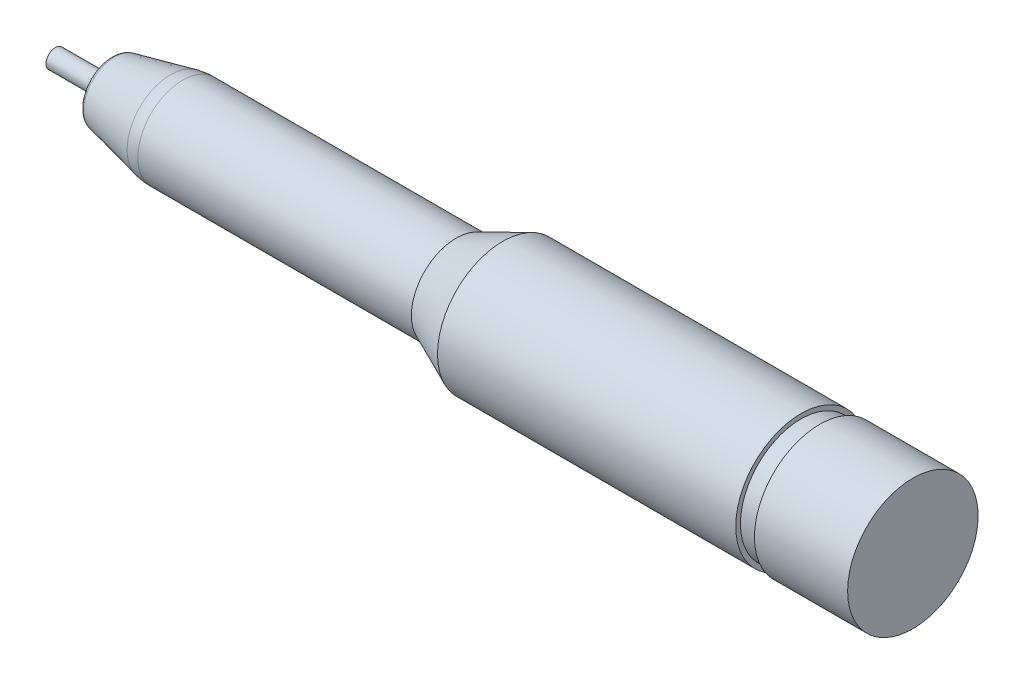
ISO-10303-21;
HEADER;
FILE_DESCRIPTION(('STEP AP214'),'2;1');
FILE_NAME('part.step','',(''),(''),'','','');
FILE_SCHEMA(('AUTOMOTIVE_DESIGN { 1 0 10303 214 1 1 1 1 }'));
ENDSEC;
DATA;
#1=APPLICATION_CONTEXT('core data for automotive mechanical design processes');
#2=APPLICATION_PROTOCOL_DEFINITION('international standard','automotive_design',2000,#1);
#3=PRODUCT_CONTEXT('',#1,'mechanical');
#4=PRODUCT('Part','Part','',(#3));
#5=PRODUCT_RELATED_PRODUCT_CATEGORY('part','',(#4));
#6=PRODUCT_DEFINITION_FORMATION('','',#4);
#7=PRODUCT_DEFINITION_CONTEXT('part definition',#1,'design');
#8=PRODUCT_DEFINITION('design','',#6,#7);
#9=PRODUCT_DEFINITION_SHAPE('','',#8);
#10=(LENGTH_UNIT() NAMED_UNIT(*) SI_UNIT(.MILLI.,.METRE.));
#11=(NAMED_UNIT(*) PLANE_ANGLE_UNIT() SI_UNIT($,.RADIAN.));
#12=(NAMED_UNIT(*) SI_UNIT($,.STERADIAN.) SOLID_ANGLE_UNIT());
#13=UNCERTAINTY_MEASURE_WITH_UNIT(LENGTH_MEASURE(1.E-05),#10,'distance_accuracy_value','');
#14=(GEOMETRIC_REPRESENTATION_CONTEXT(3) GLOBAL_UNCERTAINTY_ASSIGNED_CONTEXT((#13)) GLOBAL_UNIT_ASSIGNED_CONTEXT((#10,
#11,#12)) REPRESENTATION_CONTEXT('',''));
#15=CARTESIAN_POINT('',(0.,0.,0.));
#16=DIRECTION('',(0.,0.,1.));
#17=DIRECTION('',(1.,0.,0.));
#18=AXIS2_PLACEMENT_3D('',#15,#16,#17);
#19=CARTESIAN_POINT('',(0.,1.,0.));
#20=DIRECTION('',(1.,0.,0.));
#21=DIRECTION('',(0.,0.,-1.));
#22=AXIS2_PLACEMENT_3D('',#19,#20,#21);
#23=PLANE('',#22);
#24=CARTESIAN_POINT('',(0.,0.,0.));
#25=DIRECTION('',(-1.,0.,0.));
#26=DIRECTION('',(0.,0.,1.));
#27=AXIS2_PLACEMENT_3D('',#24,#25,#26);
#28=CIRCLE('',#27,1.);
#29=CARTESIAN_POINT('',(0.,0.,1.));
#30=VERTEX_POINT('',#29);
#31=EDGE_CURVE('E78',#30,#30,#28,.T.);
#32=ORIENTED_EDGE('',*,*,#31,.T.);
#33=EDGE_LOOP('',(#32));
#34=FACE_BOUND('',#33,.T.);
#35=ADVANCED_FACE('F34',(#34),#23,.F.);
#36=CARTESIAN_POINT('',(92.,0.,0.));
#37=DIRECTION('',(-1.,0.,0.));
#38=DIRECTION('',(0.,0.,1.));
#39=AXIS2_PLACEMENT_3D('',#36,#37,#38);
#40=PLANE('',#39);
#41=CARTESIAN_POINT('',(92.,0.,0.));
#42=DIRECTION('',(-1.,0.,0.));
#43=DIRECTION('',(0.,0.,1.));
#44=AXIS2_PLACEMENT_3D('',#41,#42,#43);
#45=CIRCLE('',#44,7.);
#46=CARTESIAN_POINT('',(92.,0.,7.));
#47=VERTEX_POINT('',#46);
#48=EDGE_CURVE('E54',#47,#47,#45,.T.);
#49=ORIENTED_EDGE('',*,*,#48,.F.);
#50=EDGE_LOOP('',(#49));
#51=FACE_BOUND('',#50,.T.);
#52=ADVANCED_FACE('F101',(#51),#40,.F.);
#53=CARTESIAN_POINT('',(0.,0.,0.));
#54=DIRECTION('',(-1.,0.,0.));
#55=DIRECTION('',(0.,0.,1.));
#56=AXIS2_PLACEMENT_3D('',#53,#54,#55);
#57=CYLINDRICAL_SURFACE('',#56,7.);
#58=CARTESIAN_POINT('',(82.,0.,0.));
#59=DIRECTION('',(-1.,0.,0.));
#60=DIRECTION('',(0.,0.,1.));
#61=AXIS2_PLACEMENT_3D('',#58,#59,#60);
#62=CIRCLE('',#61,7.);
#63=CARTESIAN_POINT('',(82.,0.,7.));
#64=VERTEX_POINT('',#63);
#65=EDGE_CURVE('E57',#64,#64,#62,.T.);
#66=ORIENTED_EDGE('',*,*,#65,.F.);
#67=EDGE_LOOP('',(#66));
#68=FACE_BOUND('',#67,.T.);
#69=ORIENTED_EDGE('',*,*,#48,.T.);
#70=EDGE_LOOP('',(#69));
#71=FACE_BOUND('',#70,.T.);
#72=ADVANCED_FACE('F106',(#68,#71),#57,.T.);
#73=CARTESIAN_POINT('',(82.,7.,0.));
#74=DIRECTION('',(1.,0.,0.));
#75=DIRECTION('',(0.,0.,-1.));
#76=AXIS2_PLACEMENT_3D('',#73,#74,#75);
#77=PLANE('',#76);
#78=CARTESIAN_POINT('',(82.,0.,0.));
#79=DIRECTION('',(-1.,0.,0.));
#80=DIRECTION('',(0.,0.,1.));
#81=AXIS2_PLACEMENT_3D('',#78,#79,#80);
#82=CIRCLE('',#81,6.5);
#83=CARTESIAN_POINT('',(82.,0.,6.5));
#84=VERTEX_POINT('',#83);
#85=EDGE_CURVE('E60',#84,#84,#82,.T.);
#86=ORIENTED_EDGE('',*,*,#85,.F.);
#87=EDGE_LOOP('',(#86));
#88=FACE_BOUND('',#87,.T.);
#89=ORIENTED_EDGE('',*,*,#65,.T.);
#90=EDGE_LOOP('',(#89));
#91=FACE_BOUND('',#90,.T.);
#92=ADVANCED_FACE('F194',(#88,#91),#77,.F.);
#93=CARTESIAN_POINT('',(0.,0.,0.));
#94=DIRECTION('',(-1.,0.,0.));
#95=DIRECTION('',(0.,0.,1.));
#96=AXIS2_PLACEMENT_3D('',#93,#94,#95);
#97=CYLINDRICAL_SURFACE('',#96,6.5);
#98=CARTESIAN_POINT('',(80.,0.,0.));
#99=DIRECTION('',(-1.,0.,0.));
#100=DIRECTION('',(0.,0.,1.));
#101=AXIS2_PLACEMENT_3D('',#98,#99,#100);
#102=CIRCLE('',#101,6.5);
#103=CARTESIAN_POINT('',(80.,0.,6.5));
#104=VERTEX_POINT('',#103);
#105=EDGE_CURVE('E63',#104,#104,#102,.T.);
#106=ORIENTED_EDGE('',*,*,#105,.F.);
#107=EDGE_LOOP('',(#106));
#108=FACE_BOUND('',#107,.T.);
#109=ORIENTED_EDGE('',*,*,#85,.T.);
#110=EDGE_LOOP('',(#109));
#111=FACE_BOUND('',#110,.T.);
#112=ADVANCED_FACE('F184',(#108,#111),#97,.T.);
#113=CARTESIAN_POINT('',(80.,7.,0.));
#114=DIRECTION('',(-1.,0.,0.));
#115=DIRECTION('',(0.,0.,1.));
#116=AXIS2_PLACEMENT_3D('',#113,#114,#115);
#117=PLANE('',#116);
#118=CARTESIAN_POINT('',(80.,0.,0.));
#119=DIRECTION('',(-1.,0.,0.));
#120=DIRECTION('',(0.,0.,1.));
#121=AXIS2_PLACEMENT_3D('',#118,#119,#120);
#122=CIRCLE('',#121,7.);
#123=CARTESIAN_POINT('',(80.,0.,7.));
#124=VERTEX_POINT('',#123);
#125=EDGE_CURVE('E66',#124,#124,#122,.T.);
#126=ORIENTED_EDGE('',*,*,#125,.F.);
#127=EDGE_LOOP('',(#126));
#128=FACE_BOUND('',#127,.T.);
#129=ORIENTED_EDGE('',*,*,#105,.T.);
#130=EDGE_LOOP('',(#129));
#131=FACE_BOUND('',#130,.T.);
#132=ADVANCED_FACE('F172',(#128,#131),#117,.F.);
#133=CARTESIAN_POINT('',(0.,0.,0.));
#134=DIRECTION('',(-1.,0.,0.));
#135=DIRECTION('',(0.,0.,1.));
#136=AXIS2_PLACEMENT_3D('',#133,#134,#135);
#137=CYLINDRICAL_SURFACE('',#136,7.);
#138=CARTESIAN_POINT('',(48.,0.,0.));
#139=DIRECTION('',(-1.,0.,0.));
#140=DIRECTION('',(0.,0.,1.));
#141=AXIS2_PLACEMENT_3D('',#138,#139,#140);
#142=CIRCLE('',#141,7.);
#143=CARTESIAN_POINT('',(48.,0.,7.));
#144=VERTEX_POINT('',#143);
#145=EDGE_CURVE('E69',#144,#144,#142,.T.);
#146=ORIENTED_EDGE('',*,*,#145,.F.);
#147=EDGE_LOOP('',(#146));
#148=FACE_BOUND('',#147,.T.);
#149=ORIENTED_EDGE('',*,*,#125,.T.);
#150=EDGE_LOOP('',(#149));
#151=FACE_BOUND('',#150,.T.);
#152=ADVANCED_FACE('F161',(#148,#151),#137,.T.);
#153=CARTESIAN_POINT('',(48.,0.,0.));
#154=DIRECTION('',(1.,0.,0.));
#155=DIRECTION('',(0.,0.,-1.));
#156=AXIS2_PLACEMENT_3D('',#153,#154,#155);
#157=CONICAL_SURFACE('',#156,7.,0.414506874584786);
#158=CARTESIAN_POINT('',(43.,0.,0.));
#159=DIRECTION('',(-1.,0.,0.));
#160=DIRECTION('',(0.,0.,1.));
#161=AXIS2_PLACEMENT_3D('',#158,#159,#160);
#162=CIRCLE('',#161,4.8);
#163=CARTESIAN_POINT('',(43.,0.,4.8));
#164=VERTEX_POINT('',#163);
#165=EDGE_CURVE('E72',#164,#164,#162,.T.);
#166=ORIENTED_EDGE('',*,*,#165,.F.);
#167=EDGE_LOOP('',(#166));
#168=FACE_BOUND('',#167,.T.);
#169=ORIENTED_EDGE('',*,*,#145,.T.);
#170=EDGE_LOOP('',(#169));
#171=FACE_BOUND('',#170,.T.);
#172=ADVANCED_FACE('F139',(#168,#171),#157,.T.);
#173=CARTESIAN_POINT('',(0.,0.,0.));
#174=DIRECTION('',(-1.,0.,0.));
#175=DIRECTION('',(0.,0.,1.));
#176=AXIS2_PLACEMENT_3D('',#173,#174,#175);
#177=CYLINDRICAL_SURFACE('',#176,4.8);
#178=CARTESIAN_POINT('',(13.6563368337968,0.,0.));
#179=DIRECTION('',(1.,0.,0.));
#180=DIRECTION('',(0.,0.,-1.));
#181=AXIS2_PLACEMENT_3D('',#178,#179,#180);
#182=CIRCLE('',#181,4.8);
#183=CARTESIAN_POINT('',(13.6563368337968,0.,-4.8));
#184=VERTEX_POINT('',#183);
#185=EDGE_CURVE('E10',#184,#184,#182,.T.);
#186=ORIENTED_EDGE('',*,*,#185,.T.);
#187=EDGE_LOOP('',(#186));
#188=FACE_BOUND('',#187,.T.);
#189=ORIENTED_EDGE('',*,*,#165,.T.);
#190=EDGE_LOOP('',(#189));
#191=FACE_BOUND('',#190,.T.);
#192=ADVANCED_FACE('F98',(#188,#191),#177,.T.);
#193=CARTESIAN_POINT('',(13.,0.,0.));
#194=DIRECTION('',(1.,0.,0.));
#195=DIRECTION('',(0.,0.,-1.));
#196=AXIS2_PLACEMENT_3D('',#193,#194,#195);
#197=CONICAL_SURFACE('',#196,4.8,0.217912516366172);
#198=CARTESIAN_POINT('',(12.3591849590204,0.,0.));
#199=DIRECTION('',(-1.,0.,0.));
#200=DIRECTION('',(0.,0.,1.));
#201=AXIS2_PLACEMENT_3D('',#198,#199,#200);
#202=CIRCLE('',#201,4.65810524092593);
#203=CARTESIAN_POINT('',(12.3591849590204,0.,4.65810524092593));
#204=VERTEX_POINT('',#203);
#205=EDGE_CURVE('E41',#204,#204,#202,.T.);
#206=ORIENTED_EDGE('',*,*,#205,.T.);
#207=EDGE_LOOP('',(#206));
#208=FACE_BOUND('',#207,.T.);
#209=CARTESIAN_POINT('',(6.3919040104353,0.,0.));
#210=DIRECTION('',(-1.,0.,0.));
#211=DIRECTION('',(0.,0.,1.));
#212=AXIS2_PLACEMENT_3D('',#209,#210,#211);
#213=CIRCLE('',#212,3.33677874516782);
#214=CARTESIAN_POINT('',(6.3919040104353,0.,3.33677874516782));
#215=VERTEX_POINT('',#214);
#216=EDGE_CURVE('E45',#215,#215,#213,.F.);
#217=ORIENTED_EDGE('',*,*,#216,.T.);
#218=EDGE_LOOP('',(#217));
#219=FACE_BOUND('',#218,.T.);
#220=ADVANCED_FACE('F92',(#208,#219),#197,.T.);
#221=CARTESIAN_POINT('',(6.,3.25,0.));
#222=DIRECTION('',(1.,0.,0.));
#223=DIRECTION('',(0.,0.,-1.));
#224=AXIS2_PLACEMENT_3D('',#221,#222,#223);
#225=PLANE('',#224);
#226=CARTESIAN_POINT('',(6.,0.,0.));
#227=DIRECTION('',(1.,0.,0.));
#228=DIRECTION('',(0.,0.,-1.));
#229=AXIS2_PLACEMENT_3D('',#226,#227,#228);
#230=CIRCLE('',#229,2.84860330842399);
#231=CARTESIAN_POINT('',(6.,0.,-2.84860330842399));
#232=VERTEX_POINT('',#231);
#233=EDGE_CURVE('E49',#232,#232,#230,.F.);
#234=ORIENTED_EDGE('',*,*,#233,.T.);
#235=EDGE_LOOP('',(#234));
#236=FACE_BOUND('',#235,.T.);
#237=CARTESIAN_POINT('',(6.,0.,0.));
#238=DIRECTION('',(-1.,0.,0.));
#239=DIRECTION('',(0.,0.,1.));
#240=AXIS2_PLACEMENT_3D('',#237,#238,#239);
#241=CIRCLE('',#240,1.);
#242=CARTESIAN_POINT('',(6.,0.,1.));
#243=VERTEX_POINT('',#242);
#244=EDGE_CURVE('E75',#243,#243,#241,.T.);
#245=ORIENTED_EDGE('',*,*,#244,.F.);
#246=EDGE_LOOP('',(#245));
#247=FACE_BOUND('',#246,.T.);
#248=ADVANCED_FACE('F87',(#236,#247),#225,.F.);
#249=CARTESIAN_POINT('',(0.,0.,0.));
#250=DIRECTION('',(-1.,0.,0.));
#251=DIRECTION('',(0.,0.,1.));
#252=AXIS2_PLACEMENT_3D('',#249,#250,#251);
#253=CYLINDRICAL_SURFACE('',#252,1.);
#254=ORIENTED_EDGE('',*,*,#31,.F.);
#255=EDGE_LOOP('',(#254));
#256=FACE_BOUND('',#255,.T.);
#257=ORIENTED_EDGE('',*,*,#244,.T.);
#258=EDGE_LOOP('',(#257));
#259=FACE_BOUND('',#258,.T.);
#260=ADVANCED_FACE('F83',(#256,#259),#253,.T.);
#261=CARTESIAN_POINT('',(6.5,0.,0.));
#262=DIRECTION('',(1.,0.,0.));
#263=DIRECTION('',(0.,0.,-1.));
#264=AXIS2_PLACEMENT_3D('',#261,#262,#263);
#265=TOROIDAL_SURFACE('',#264,2.84860330842399,0.5);
#266=ORIENTED_EDGE('',*,*,#216,.F.);
#267=EDGE_LOOP('',(#266));
#268=FACE_BOUND('',#267,.T.);
#269=ORIENTED_EDGE('',*,*,#233,.F.);
#270=EDGE_LOOP('',(#269));
#271=FACE_BOUND('',#270,.T.);
#272=ADVANCED_FACE('F86',(#268,#271),#265,.T.);
#273=CARTESIAN_POINT('',(13.6563368337968,0.,0.));
#274=DIRECTION('',(1.,0.,0.));
#275=DIRECTION('',(0.,0.,-1.));
#276=AXIS2_PLACEMENT_3D('',#273,#274,#275);
#277=DEGENERATE_TOROIDAL_SURFACE('',#276,1.2,6.,.F.);
#278=ORIENTED_EDGE('',*,*,#185,.F.);
#279=EDGE_LOOP('',(#278));
#280=FACE_BOUND('',#279,.T.);
#281=ORIENTED_EDGE('',*,*,#205,.F.);
#282=EDGE_LOOP('',(#281));
#283=FACE_BOUND('',#282,.T.);
#284=ADVANCED_FACE('F36',(#280,#283),#277,.F.);
#285=CLOSED_SHELL('',(#35,#52,#72,#92,#112,#132,#152,#172,#192,#220,#248,#260,#272,#284));
#286=MANIFOLD_SOLID_BREP('B2',#285);
#287=ADVANCED_BREP_SHAPE_REPRESENTATION('',(#18,#286),#14);
#288=SHAPE_DEFINITION_REPRESENTATION(#9,#287);
ENDSEC;
END-ISO-10303-21;
